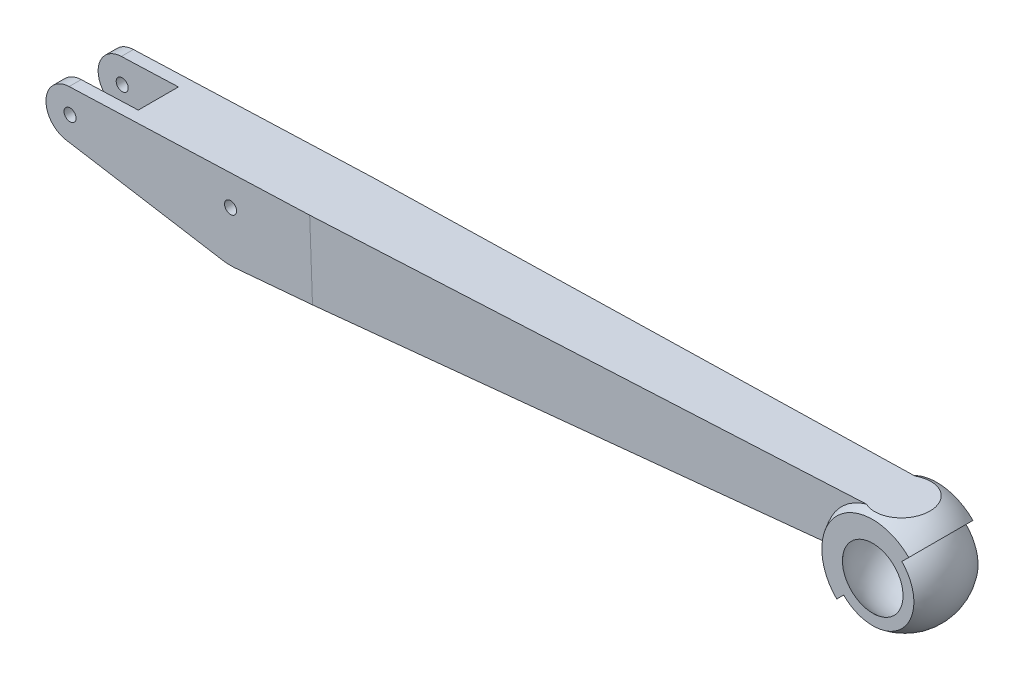
ISO-10303-21;
HEADER;
FILE_DESCRIPTION(('STEP AP214'),'2;1');
FILE_NAME('part.step','',(''),(''),'','','');
FILE_SCHEMA(('AUTOMOTIVE_DESIGN { 1 0 10303 214 1 1 1 1 }'));
ENDSEC;
DATA;
#1=APPLICATION_CONTEXT('core data for automotive mechanical design processes');
#2=APPLICATION_PROTOCOL_DEFINITION('international standard','automotive_design',2000,#1);
#3=PRODUCT_CONTEXT('',#1,'mechanical');
#4=PRODUCT('Part','Part','',(#3));
#5=PRODUCT_RELATED_PRODUCT_CATEGORY('part','',(#4));
#6=PRODUCT_DEFINITION_FORMATION('','',#4);
#7=PRODUCT_DEFINITION_CONTEXT('part definition',#1,'design');
#8=PRODUCT_DEFINITION('design','',#6,#7);
#9=PRODUCT_DEFINITION_SHAPE('','',#8);
#10=(LENGTH_UNIT() NAMED_UNIT(*) SI_UNIT(.MILLI.,.METRE.));
#11=(NAMED_UNIT(*) PLANE_ANGLE_UNIT() SI_UNIT($,.RADIAN.));
#12=(NAMED_UNIT(*) SI_UNIT($,.STERADIAN.) SOLID_ANGLE_UNIT());
#13=UNCERTAINTY_MEASURE_WITH_UNIT(LENGTH_MEASURE(1.E-05),#10,'distance_accuracy_value','');
#14=(GEOMETRIC_REPRESENTATION_CONTEXT(3) GLOBAL_UNCERTAINTY_ASSIGNED_CONTEXT((#13)) GLOBAL_UNIT_ASSIGNED_CONTEXT((#10,
#11,#12)) REPRESENTATION_CONTEXT('',''));
#15=CARTESIAN_POINT('',(0.,0.,0.));
#16=DIRECTION('',(0.,0.,1.));
#17=DIRECTION('',(1.,0.,0.));
#18=AXIS2_PLACEMENT_3D('',#15,#16,#17);
#19=CARTESIAN_POINT('',(0.,0.,8.));
#20=DIRECTION('',(0.,0.,-1.));
#21=DIRECTION('',(-1.,0.,0.));
#22=AXIS2_PLACEMENT_3D('',#19,#20,#21);
#23=CYLINDRICAL_SURFACE('',#22,12.5269384468381);
#24=CARTESIAN_POINT('',(0.,0.,-5.));
#25=DIRECTION('',(0.,0.,1.));
#26=DIRECTION('',(1.,0.,0.));
#27=AXIS2_PLACEMENT_3D('',#24,#25,#26);
#28=CIRCLE('',#27,12.5269384468381);
#29=CARTESIAN_POINT('',(-2.04406390424603,-12.3590448500775,-5.));
#30=VERTEX_POINT('',#29);
#31=CARTESIAN_POINT('',(1.08223577138531,-12.4801022666484,-5.));
#32=VERTEX_POINT('',#31);
#33=EDGE_CURVE('E243',#30,#32,#28,.T.);
#34=ORIENTED_EDGE('',*,*,#33,.F.);
#35=DIRECTION('',(0.,0.,-1.));
#36=VECTOR('',#35,1.);
#37=CARTESIAN_POINT('',(-2.04406390424603,-12.3590448500775,8.));
#38=LINE('',#37,#36);
#39=CARTESIAN_POINT('',(-2.04406390424603,-12.3590448500775,-8.));
#40=VERTEX_POINT('',#39);
#41=EDGE_CURVE('E341',#30,#40,#38,.T.);
#42=ORIENTED_EDGE('',*,*,#41,.T.);
#43=CARTESIAN_POINT('',(0.,0.,-8.));
#44=DIRECTION('',(0.,0.,1.));
#45=DIRECTION('',(1.,0.,0.));
#46=AXIS2_PLACEMENT_3D('',#43,#44,#45);
#47=CIRCLE('',#46,12.5269384468381);
#48=CARTESIAN_POINT('',(1.08223577138531,-12.4801022666484,-8.));
#49=VERTEX_POINT('',#48);
#50=EDGE_CURVE('E327',#40,#49,#47,.T.);
#51=ORIENTED_EDGE('',*,*,#50,.T.);
#52=DIRECTION('',(0.,0.,-1.));
#53=VECTOR('',#52,1.);
#54=CARTESIAN_POINT('',(1.08223577138531,-12.4801022666484,8.));
#55=LINE('',#54,#53);
#56=EDGE_CURVE('E366',#32,#49,#55,.T.);
#57=ORIENTED_EDGE('',*,*,#56,.F.);
#58=EDGE_LOOP('',(#34,#42,#51,#57));
#59=FACE_BOUND('',#58,.T.);
#60=ADVANCED_FACE('F35',(#59),#23,.T.);
#61=CARTESIAN_POINT('',(160.,0.,0.));
#62=DIRECTION('',(-1.,0.,0.));
#63=DIRECTION('',(0.,1.,0.));
#64=AXIS2_PLACEMENT_3D('',#61,#62,#63);
#65=SPHERICAL_SURFACE('',#64,15.);
#66=CARTESIAN_POINT('',(159.505151467158,13.3817007512717,0.));
#67=DIRECTION('',(0.0369542362489187,-0.999316958939084,0.));
#68=DIRECTION('',(0.999316958939084,0.0369542362489187,0.));
#69=AXIS2_PLACEMENT_3D('',#66,#67,#68);
#70=CIRCLE('',#69,6.75908351279662);
#71=CARTESIAN_POINT('',(156.493436870342,13.2703290671133,6.04999020397985));
#72=VERTEX_POINT('',#71);
#73=CARTESIAN_POINT('',(156.493436870342,13.2703290671133,-6.04999020397985));
#74=VERTEX_POINT('',#73);
#75=EDGE_CURVE('E379',#72,#74,#70,.F.);
#76=ORIENTED_EDGE('',*,*,#75,.F.);
#77=CARTESIAN_POINT('',(160.08550336549,0.00316187125628183,6.00583569941776));
#78=DIRECTION('',(-0.0142352695206122,-0.000526413074676742,-0.999898534847887));
#79=DIRECTION('',(-0.999898673389219,0.,0.0142352714929856));
#80=AXIS2_PLACEMENT_3D('',#77,#78,#79);
#81=CIRCLE('',#80,13.744912394361);
#82=CARTESIAN_POINT('',(146.342449375036,0.116413047256878,6.20143200631746));
#83=VERTEX_POINT('',#82);
#84=EDGE_CURVE('E376',#83,#72,#81,.T.);
#85=ORIENTED_EDGE('',*,*,#84,.F.);
#86=CARTESIAN_POINT('',(159.888044575374,1.29104506206708,0.));
#87=DIRECTION('',(-0.0863926789437108,0.996261163061639,0.));
#88=DIRECTION('',(-0.996261163061639,-0.0863926789437108,0.));
#89=AXIS2_PLACEMENT_3D('',#86,#87,#88);
#90=CIRCLE('',#89,14.9439174459246);
#91=CARTESIAN_POINT('',(146.342449375036,0.116413047256877,-6.20143200631746));
#92=VERTEX_POINT('',#91);
#93=EDGE_CURVE('E311',#92,#83,#90,.T.);
#94=ORIENTED_EDGE('',*,*,#93,.F.);
#95=CARTESIAN_POINT('',(160.08550336549,0.00316187125628183,-6.00583569941776));
#96=DIRECTION('',(-0.0142352695206122,-0.000526413074676742,0.999898534847887));
#97=DIRECTION('',(0.999898673389219,0.,0.0142352714929856));
#98=AXIS2_PLACEMENT_3D('',#95,#96,#97);
#99=CIRCLE('',#98,13.744912394361);
#100=EDGE_CURVE('E314',#74,#92,#99,.T.);
#101=ORIENTED_EDGE('',*,*,#100,.F.);
#102=EDGE_LOOP('',(#76,#85,#94,#101));
#103=FACE_BOUND('',#102,.T.);
#104=CARTESIAN_POINT('',(160.,0.,-8.));
#105=DIRECTION('',(0.,0.,1.));
#106=DIRECTION('',(1.,0.,0.));
#107=AXIS2_PLACEMENT_3D('',#104,#105,#106);
#108=CIRCLE('',#107,12.6885775404495);
#109=CARTESIAN_POINT('',(151.027820777537,-8.97217922246309,-7.99999999999999));
#110=VERTEX_POINT('',#109);
#111=CARTESIAN_POINT('',(168.972179222463,8.97217922246318,-7.99999999999999));
#112=VERTEX_POINT('',#111);
#113=EDGE_CURVE('E296',#110,#112,#108,.F.);
#114=ORIENTED_EDGE('',*,*,#113,.F.);
#115=CARTESIAN_POINT('',(160.,0.,0.));
#116=DIRECTION('',(0.707106781186544,-0.707106781186551,0.));
#117=DIRECTION('',(0.707106781186551,0.707106781186544,0.));
#118=AXIS2_PLACEMENT_3D('',#115,#116,#117);
#119=CIRCLE('',#118,15.);
#120=CARTESIAN_POINT('',(151.027820777537,-8.97217922246309,7.99999999999999));
#121=VERTEX_POINT('',#120);
#122=EDGE_CURVE('E278',#121,#110,#119,.T.);
#123=ORIENTED_EDGE('',*,*,#122,.F.);
#124=CARTESIAN_POINT('',(160.,0.,8.));
#125=DIRECTION('',(0.,0.,-1.));
#126=DIRECTION('',(-1.,0.,0.));
#127=AXIS2_PLACEMENT_3D('',#124,#125,#126);
#128=CIRCLE('',#127,12.6885775404495);
#129=CARTESIAN_POINT('',(168.972179222463,8.97217922246319,8.));
#130=VERTEX_POINT('',#129);
#131=EDGE_CURVE('E288',#130,#121,#128,.F.);
#132=ORIENTED_EDGE('',*,*,#131,.F.);
#133=CARTESIAN_POINT('',(160.,0.,0.));
#134=DIRECTION('',(-0.707106781186549,0.707106781186546,0.));
#135=DIRECTION('',(-0.707106781186546,-0.707106781186549,0.));
#136=AXIS2_PLACEMENT_3D('',#133,#134,#135);
#137=CIRCLE('',#136,15.);
#138=EDGE_CURVE('E60',#130,#112,#137,.T.);
#139=ORIENTED_EDGE('',*,*,#138,.T.);
#140=EDGE_LOOP('',(#114,#123,#132,#139));
#141=FACE_BOUND('',#140,.T.);
#142=ADVANCED_FACE('F474',(#103,#141),#65,.T.);
#143=CARTESIAN_POINT('',(130.,-15.,-8.));
#144=DIRECTION('',(0.,0.,1.));
#145=DIRECTION('',(1.,0.,0.));
#146=AXIS2_PLACEMENT_3D('',#143,#144,#145);
#147=PLANE('',#146);
#148=CARTESIAN_POINT('',(160.,0.,-8.));
#149=DIRECTION('',(0.,0.,1.));
#150=DIRECTION('',(1.,0.,0.));
#151=AXIS2_PLACEMENT_3D('',#148,#149,#150);
#152=CIRCLE('',#151,7.54983443527072);
#153=CARTESIAN_POINT('',(165.338539126016,5.33853912601566,-8.));
#154=VERTEX_POINT('',#153);
#155=EDGE_CURVE('E262',#154,#154,#152,.F.);
#156=ORIENTED_EDGE('',*,*,#155,.F.);
#157=EDGE_LOOP('',(#156));
#158=FACE_BOUND('',#157,.T.);
#159=DIRECTION('',(0.707106781186552,0.707106781186543,0.));
#160=VECTOR('',#159,1.);
#161=CARTESIAN_POINT('',(151.027820777537,-8.97217922246309,-7.99999999999999));
#162=LINE('',#161,#160);
#163=CARTESIAN_POINT('',(152.754311626905,-7.24568837309467,-7.99999999999998));
#164=VERTEX_POINT('',#163);
#165=EDGE_CURVE('E280',#110,#164,#162,.T.);
#166=ORIENTED_EDGE('',*,*,#165,.F.);
#167=ORIENTED_EDGE('',*,*,#113,.T.);
#168=DIRECTION('',(-0.707106781186548,-0.707106781186548,0.));
#169=VECTOR('',#168,1.);
#170=CARTESIAN_POINT('',(168.972179222463,8.97217922246318,-7.99999999999999));
#171=LINE('',#170,#169);
#172=CARTESIAN_POINT('',(167.245688373095,7.24568837309475,-7.99999999999998));
#173=VERTEX_POINT('',#172);
#174=EDGE_CURVE('E270',#112,#173,#171,.T.);
#175=ORIENTED_EDGE('',*,*,#174,.T.);
#176=CARTESIAN_POINT('',(160.,0.,-7.99999999999999));
#177=DIRECTION('',(0.,0.,1.));
#178=DIRECTION('',(1.,0.,0.));
#179=AXIS2_PLACEMENT_3D('',#176,#177,#178);
#180=CIRCLE('',#179,10.2469507659596);
#181=EDGE_CURVE('E283',#164,#173,#180,.T.);
#182=ORIENTED_EDGE('',*,*,#181,.F.);
#183=EDGE_LOOP('',(#166,#167,#175,#182));
#184=FACE_BOUND('',#183,.T.);
#185=ADVANCED_FACE('F477',(#158,#184),#147,.F.);
#186=CARTESIAN_POINT('',(130.,-15.,8.));
#187=DIRECTION('',(0.,0.,-1.));
#188=DIRECTION('',(-1.,0.,0.));
#189=AXIS2_PLACEMENT_3D('',#186,#187,#188);
#190=PLANE('',#189);
#191=CARTESIAN_POINT('',(160.,0.,8.));
#192=DIRECTION('',(0.,0.,-1.));
#193=DIRECTION('',(-1.,0.,0.));
#194=AXIS2_PLACEMENT_3D('',#191,#192,#193);
#195=CIRCLE('',#194,7.54983443527072);
#196=CARTESIAN_POINT('',(165.338539126016,5.33853912601566,8.));
#197=VERTEX_POINT('',#196);
#198=EDGE_CURVE('E261',#197,#197,#195,.F.);
#199=ORIENTED_EDGE('',*,*,#198,.F.);
#200=EDGE_LOOP('',(#199));
#201=FACE_BOUND('',#200,.T.);
#202=DIRECTION('',(-0.70710678118655,-0.707106781186545,0.));
#203=VECTOR('',#202,1.);
#204=CARTESIAN_POINT('',(151.027820777537,-8.97217922246309,7.99999999999999));
#205=LINE('',#204,#203);
#206=CARTESIAN_POINT('',(152.754311626905,-7.24568837309466,7.99999999999999));
#207=VERTEX_POINT('',#206);
#208=EDGE_CURVE('E276',#207,#121,#205,.T.);
#209=ORIENTED_EDGE('',*,*,#208,.F.);
#210=CARTESIAN_POINT('',(160.,0.,7.99999999999999));
#211=DIRECTION('',(0.,0.,1.));
#212=DIRECTION('',(1.,0.,0.));
#213=AXIS2_PLACEMENT_3D('',#210,#211,#212);
#214=CIRCLE('',#213,10.2469507659596);
#215=CARTESIAN_POINT('',(167.245688373095,7.24568837309474,7.99999999999999));
#216=VERTEX_POINT('',#215);
#217=EDGE_CURVE('E285',#207,#216,#214,.T.);
#218=ORIENTED_EDGE('',*,*,#217,.T.);
#219=DIRECTION('',(0.707106781186545,0.70710678118655,0.));
#220=VECTOR('',#219,1.);
#221=CARTESIAN_POINT('',(168.972179222463,8.97217922246318,7.99999999999999));
#222=LINE('',#221,#220);
#223=EDGE_CURVE('E267',#216,#130,#222,.T.);
#224=ORIENTED_EDGE('',*,*,#223,.T.);
#225=ORIENTED_EDGE('',*,*,#131,.T.);
#226=EDGE_LOOP('',(#209,#218,#224,#225));
#227=FACE_BOUND('',#226,.T.);
#228=ADVANCED_FACE('F489',(#201,#227),#190,.F.);
#229=CARTESIAN_POINT('',(-40.,0.,8.));
#230=DIRECTION('',(0.,0.,-1.));
#231=DIRECTION('',(-1.,0.,0.));
#232=AXIS2_PLACEMENT_3D('',#229,#230,#231);
#233=CYLINDRICAL_SURFACE('',#232,6.);
#234=DIRECTION('',(0.,0.,-1.));
#235=VECTOR('',#234,1.);
#236=CARTESIAN_POINT('',(-40.9790407670257,-5.91958437531739,8.));
#237=LINE('',#236,#235);
#238=CARTESIAN_POINT('',(-40.9790407670257,-5.91958437531739,-4.99999999999999));
#239=VERTEX_POINT('',#238);
#240=CARTESIAN_POINT('',(-40.9790407670257,-5.91958437531739,-8.));
#241=VERTEX_POINT('',#240);
#242=EDGE_CURVE('E358',#239,#241,#237,.T.);
#243=ORIENTED_EDGE('',*,*,#242,.F.);
#244=CARTESIAN_POINT('',(-40.,0.,-4.99999999999999));
#245=DIRECTION('',(0.,0.,-1.));
#246=DIRECTION('',(-1.,0.,0.));
#247=AXIS2_PLACEMENT_3D('',#244,#245,#246);
#248=CIRCLE('',#247,6.);
#249=CARTESIAN_POINT('',(-40.2217254174935,5.9959017536345,-4.99999999999999));
#250=VERTEX_POINT('',#249);
#251=EDGE_CURVE('E305',#239,#250,#248,.T.);
#252=ORIENTED_EDGE('',*,*,#251,.T.);
#253=DIRECTION('',(0.,0.,-1.));
#254=VECTOR('',#253,1.);
#255=CARTESIAN_POINT('',(-40.2217254174935,5.9959017536345,8.));
#256=LINE('',#255,#254);
#257=CARTESIAN_POINT('',(-40.2217254174935,5.9959017536345,-8.));
#258=VERTEX_POINT('',#257);
#259=EDGE_CURVE('E362',#250,#258,#256,.T.);
#260=ORIENTED_EDGE('',*,*,#259,.T.);
#261=CARTESIAN_POINT('',(-40.,0.,-8.));
#262=DIRECTION('',(0.,0.,1.));
#263=DIRECTION('',(1.,0.,0.));
#264=AXIS2_PLACEMENT_3D('',#261,#262,#263);
#265=CIRCLE('',#264,6.);
#266=EDGE_CURVE('E350',#258,#241,#265,.T.);
#267=ORIENTED_EDGE('',*,*,#266,.T.);
#268=EDGE_LOOP('',(#243,#252,#260,#267));
#269=FACE_BOUND('',#268,.T.);
#270=ADVANCED_FACE('F473',(#269),#233,.T.);
#271=CARTESIAN_POINT('',(-2.04406390424603,-12.3590448500775,8.));
#272=VERTEX_POINT('',#271);
#273=CARTESIAN_POINT('',(-2.04406390424603,-12.3590448500775,5.));
#274=VERTEX_POINT('',#273);
#275=EDGE_CURVE('E355',#272,#274,#38,.T.);
#276=ORIENTED_EDGE('',*,*,#275,.T.);
#277=CARTESIAN_POINT('',(0.,0.,5.));
#278=DIRECTION('',(0.,0.,1.));
#279=DIRECTION('',(1.,0.,0.));
#280=AXIS2_PLACEMENT_3D('',#277,#278,#279);
#281=CIRCLE('',#280,12.5269384468381);
#282=CARTESIAN_POINT('',(1.08223577138531,-12.4801022666484,5.));
#283=VERTEX_POINT('',#282);
#284=EDGE_CURVE('E235',#274,#283,#281,.T.);
#285=ORIENTED_EDGE('',*,*,#284,.T.);
#286=CARTESIAN_POINT('',(1.08223577138531,-12.4801022666484,8.));
#287=VERTEX_POINT('',#286);
#288=EDGE_CURVE('E367',#287,#283,#55,.T.);
#289=ORIENTED_EDGE('',*,*,#288,.F.);
#290=CARTESIAN_POINT('',(0.,0.,8.));
#291=DIRECTION('',(0.,0.,1.));
#292=DIRECTION('',(1.,0.,0.));
#293=AXIS2_PLACEMENT_3D('',#290,#291,#292);
#294=CIRCLE('',#293,12.5269384468381);
#295=EDGE_CURVE('E328',#272,#287,#294,.T.);
#296=ORIENTED_EDGE('',*,*,#295,.F.);
#297=EDGE_LOOP('',(#276,#285,#289,#296));
#298=FACE_BOUND('',#297,.T.);
#299=ADVANCED_FACE('F37',(#298),#23,.T.);
#300=CARTESIAN_POINT('',(145.,0.,8.));
#301=DIRECTION('',(-0.0863926789437108,0.996261163061639,0.));
#302=DIRECTION('',(-0.996261163061639,-0.0863926789437108,0.));
#303=AXIS2_PLACEMENT_3D('',#300,#301,#302);
#304=PLANE('',#303);
#305=ORIENTED_EDGE('',*,*,#288,.T.);
#306=DIRECTION('',(0.996261163061639,0.0863926789437108,0.));
#307=VECTOR('',#306,1.);
#308=CARTESIAN_POINT('',(145.,0.,5.));
#309=LINE('',#308,#307);
#310=CARTESIAN_POINT('',(20.3918737201203,-10.8056303373225,5.));
#311=VERTEX_POINT('',#310);
#312=EDGE_CURVE('E211',#283,#311,#309,.T.);
#313=ORIENTED_EDGE('',*,*,#312,.T.);
#314=DIRECTION('',(-0.996160325095163,-0.0863839345879274,0.0142275279443665));
#315=VECTOR('',#314,1.);
#316=CARTESIAN_POINT('',(144.932257808565,-0.00587439279233178,3.22126845430105));
#317=LINE('',#316,#315);
#318=CARTESIAN_POINT('',(143.313103636008,-0.146282422108911,3.24439380938292));
#319=VERTEX_POINT('',#318);
#320=EDGE_CURVE('E220',#319,#311,#317,.T.);
#321=ORIENTED_EDGE('',*,*,#320,.F.);
#322=CARTESIAN_POINT('',(159.888044575374,1.29104506206708,0.));
#323=DIRECTION('',(-0.0863926789437108,0.996261163061639,0.));
#324=DIRECTION('',(-0.996261163061639,-0.0863926789437108,0.));
#325=AXIS2_PLACEMENT_3D('',#322,#323,#324);
#326=CIRCLE('',#325,16.9505359393327);
#327=CARTESIAN_POINT('',(143.313103636008,-0.146282422108912,-3.24439380938292));
#328=VERTEX_POINT('',#327);
#329=EDGE_CURVE('E258',#328,#319,#326,.T.);
#330=ORIENTED_EDGE('',*,*,#329,.F.);
#331=DIRECTION('',(0.996160325095163,0.0863839345879274,0.0142275279443665));
#332=VECTOR('',#331,1.);
#333=CARTESIAN_POINT('',(145.159024190363,0.0137900847003733,-3.21802969347853));
#334=LINE('',#333,#332);
#335=CARTESIAN_POINT('',(20.3918737201203,-10.8056303373225,-5.));
#336=VERTEX_POINT('',#335);
#337=EDGE_CURVE('E246',#336,#328,#334,.T.);
#338=ORIENTED_EDGE('',*,*,#337,.F.);
#339=DIRECTION('',(0.996261163061639,0.0863926789437108,0.));
#340=VECTOR('',#339,1.);
#341=CARTESIAN_POINT('',(145.,0.,-5.));
#342=LINE('',#341,#340);
#343=EDGE_CURVE('E245',#32,#336,#342,.T.);
#344=ORIENTED_EDGE('',*,*,#343,.F.);
#345=ORIENTED_EDGE('',*,*,#56,.T.);
#346=DIRECTION('',(0.996261163061639,0.0863926789437108,0.));
#347=VECTOR('',#346,1.);
#348=CARTESIAN_POINT('',(145.,0.,-8.));
#349=LINE('',#348,#347);
#350=CARTESIAN_POINT('',(20.4131885576658,-10.8037819807017,-8.));
#351=VERTEX_POINT('',#350);
#352=EDGE_CURVE('E344',#49,#351,#349,.T.);
#353=ORIENTED_EDGE('',*,*,#352,.T.);
#354=DIRECTION('',(0.996160325095163,0.0863839345879274,0.0142275279443665));
#355=VECTOR('',#354,1.);
#356=CARTESIAN_POINT('',(145.201547201554,0.0174775483793186,-6.21772679054655));
#357=LINE('',#356,#355);
#358=EDGE_CURVE('E324',#351,#92,#357,.T.);
#359=ORIENTED_EDGE('',*,*,#358,.T.);
#360=ORIENTED_EDGE('',*,*,#93,.T.);
#361=DIRECTION('',(-0.996160325095163,-0.0863839345879274,0.0142275279443665));
#362=VECTOR('',#361,1.);
#363=CARTESIAN_POINT('',(144.974780819756,-0.00218692911338649,6.22096555136907));
#364=LINE('',#363,#362);
#365=CARTESIAN_POINT('',(20.4131885576658,-10.8037819807017,8.));
#366=VERTEX_POINT('',#365);
#367=EDGE_CURVE('E320',#83,#366,#364,.T.);
#368=ORIENTED_EDGE('',*,*,#367,.T.);
#369=DIRECTION('',(0.996261163061639,0.0863926789437108,0.));
#370=VECTOR('',#369,1.);
#371=CARTESIAN_POINT('',(1.08223577138531,-12.4801022666484,8.));
#372=LINE('',#371,#370);
#373=EDGE_CURVE('E331',#287,#366,#372,.T.);
#374=ORIENTED_EDGE('',*,*,#373,.F.);
#375=EDGE_LOOP('',(#305,#313,#321,#330,#338,#344,#345,#353,#359,#360,#368,#374));
#376=FACE_BOUND('',#375,.T.);
#377=ADVANCED_FACE('F431',(#376),#304,.F.);
#378=CARTESIAN_POINT('',(-40.2217254174935,5.9959017536345,8.));
#379=DIRECTION('',(0.0369542362489186,-0.999316958939084,0.));
#380=DIRECTION('',(0.999316958939084,0.0369542362489187,0.));
#381=AXIS2_PLACEMENT_3D('',#378,#379,#380);
#382=PLANE('',#381);
#383=ORIENTED_EDGE('',*,*,#259,.F.);
#384=DIRECTION('',(0.999316958939084,0.0369542362489187,0.));
#385=VECTOR('',#384,1.);
#386=CARTESIAN_POINT('',(-40.2217254174935,5.9959017536345,-4.99999999999999));
#387=LINE('',#386,#385);
#388=CARTESIAN_POINT('',(-26.,6.52181397422091,-4.99999999999999));
#389=VERTEX_POINT('',#388);
#390=EDGE_CURVE('E308',#250,#389,#387,.T.);
#391=ORIENTED_EDGE('',*,*,#390,.T.);
#392=DIRECTION('',(0.,0.,1.));
#393=VECTOR('',#392,1.);
#394=CARTESIAN_POINT('',(-26.,6.52181397422091,8.));
#395=LINE('',#394,#393);
#396=CARTESIAN_POINT('',(-26.,6.5218139742209,5.));
#397=VERTEX_POINT('',#396);
#398=EDGE_CURVE('E302',#389,#397,#395,.T.);
#399=ORIENTED_EDGE('',*,*,#398,.T.);
#400=DIRECTION('',(-0.999316958939084,-0.0369542362489187,0.));
#401=VECTOR('',#400,1.);
#402=CARTESIAN_POINT('',(-40.2217254174935,5.9959017536345,5.));
#403=LINE('',#402,#401);
#404=CARTESIAN_POINT('',(-40.2217254174935,5.9959017536345,5.));
#405=VERTEX_POINT('',#404);
#406=EDGE_CURVE('E299',#397,#405,#403,.T.);
#407=ORIENTED_EDGE('',*,*,#406,.T.);
#408=CARTESIAN_POINT('',(-40.2217254174935,5.9959017536345,8.));
#409=VERTEX_POINT('',#408);
#410=EDGE_CURVE('E363',#409,#405,#256,.T.);
#411=ORIENTED_EDGE('',*,*,#410,.F.);
#412=DIRECTION('',(-0.999316958939084,-0.0369542362489186,0.));
#413=VECTOR('',#412,1.);
#414=CARTESIAN_POINT('',(147.077854414978,12.9221455850216,8.));
#415=LINE('',#414,#413);
#416=CARTESIAN_POINT('',(19.7099891382185,8.21214627814031,8.));
#417=VERTEX_POINT('',#416);
#418=EDGE_CURVE('E335',#417,#409,#415,.T.);
#419=ORIENTED_EDGE('',*,*,#418,.F.);
#420=DIRECTION('',(0.999215563091836,0.0369504866817164,-0.0142449994401426));
#421=VECTOR('',#420,1.);
#422=CARTESIAN_POINT('',(-40.2095640734335,5.99635147399347,8.85422408685515));
#423=LINE('',#422,#421);
#424=EDGE_CURVE('E317',#417,#72,#423,.T.);
#425=ORIENTED_EDGE('',*,*,#424,.T.);
#426=ORIENTED_EDGE('',*,*,#75,.T.);
#427=DIRECTION('',(-0.999215563091836,-0.0369504866817164,-0.0142449994401426));
#428=VECTOR('',#427,1.);
#429=CARTESIAN_POINT('',(-39.9818228712443,6.00477322858698,-8.85097736671036));
#430=LINE('',#429,#428);
#431=CARTESIAN_POINT('',(19.7099891382185,8.21214627814031,-8.));
#432=VERTEX_POINT('',#431);
#433=EDGE_CURVE('E322',#74,#432,#430,.T.);
#434=ORIENTED_EDGE('',*,*,#433,.T.);
#435=DIRECTION('',(-0.999316958939084,-0.0369542362489186,0.));
#436=VECTOR('',#435,1.);
#437=CARTESIAN_POINT('',(-40.2217254174935,5.9959017536345,-8.));
#438=LINE('',#437,#436);
#439=EDGE_CURVE('E347',#432,#258,#438,.T.);
#440=ORIENTED_EDGE('',*,*,#439,.T.);
#441=EDGE_LOOP('',(#383,#391,#399,#407,#411,#419,#425,#426,#434,#440));
#442=FACE_BOUND('',#441,.T.);
#443=ADVANCED_FACE('F464',(#442),#382,.F.);
#444=ORIENTED_EDGE('',*,*,#410,.T.);
#445=CARTESIAN_POINT('',(-40.,0.,5.));
#446=DIRECTION('',(0.,0.,1.));
#447=DIRECTION('',(1.,0.,0.));
#448=AXIS2_PLACEMENT_3D('',#445,#446,#447);
#449=CIRCLE('',#448,6.);
#450=CARTESIAN_POINT('',(-40.9790407670257,-5.91958437531739,5.));
#451=VERTEX_POINT('',#450);
#452=EDGE_CURVE('E292',#405,#451,#449,.T.);
#453=ORIENTED_EDGE('',*,*,#452,.T.);
#454=CARTESIAN_POINT('',(-40.9790407670257,-5.91958437531739,8.));
#455=VERTEX_POINT('',#454);
#456=EDGE_CURVE('E359',#455,#451,#237,.T.);
#457=ORIENTED_EDGE('',*,*,#456,.F.);
#458=CARTESIAN_POINT('',(-40.,0.,8.));
#459=DIRECTION('',(0.,0.,1.));
#460=DIRECTION('',(1.,0.,0.));
#461=AXIS2_PLACEMENT_3D('',#458,#459,#460);
#462=CIRCLE('',#461,6.);
#463=EDGE_CURVE('E337',#409,#455,#462,.T.);
#464=ORIENTED_EDGE('',*,*,#463,.F.);
#465=EDGE_LOOP('',(#444,#453,#457,#464));
#466=FACE_BOUND('',#465,.T.);
#467=ADVANCED_FACE('F459',(#466),#233,.T.);
#468=CARTESIAN_POINT('',(-40.9790407670257,-5.91958437531739,8.));
#469=DIRECTION('',(0.163173461170952,0.986597395886231,0.));
#470=DIRECTION('',(-0.986597395886231,0.163173461170952,0.));
#471=AXIS2_PLACEMENT_3D('',#468,#469,#470);
#472=PLANE('',#471);
#473=DIRECTION('',(0.,0.,-1.));
#474=VECTOR('',#473,1.);
#475=CARTESIAN_POINT('',(-23.,-8.89314007566866,8.));
#476=LINE('',#475,#474);
#477=CARTESIAN_POINT('',(-23.,-8.89314007566866,5.));
#478=VERTEX_POINT('',#477);
#479=CARTESIAN_POINT('',(-23.,-8.89314007566866,-5.));
#480=VERTEX_POINT('',#479);
#481=EDGE_CURVE('E52',#478,#480,#476,.T.);
#482=ORIENTED_EDGE('',*,*,#481,.F.);
#483=DIRECTION('',(0.986597395886231,-0.163173461170952,0.));
#484=VECTOR('',#483,1.);
#485=CARTESIAN_POINT('',(-40.9790407670257,-5.91958437531739,5.));
#486=LINE('',#485,#484);
#487=EDGE_CURVE('E210',#478,#274,#486,.T.);
#488=ORIENTED_EDGE('',*,*,#487,.T.);
#489=ORIENTED_EDGE('',*,*,#275,.F.);
#490=DIRECTION('',(0.986597395886231,-0.163173461170952,0.));
#491=VECTOR('',#490,1.);
#492=CARTESIAN_POINT('',(-40.9790407670257,-5.91958437531739,8.));
#493=LINE('',#492,#491);
#494=EDGE_CURVE('E339',#455,#272,#493,.T.);
#495=ORIENTED_EDGE('',*,*,#494,.F.);
#496=ORIENTED_EDGE('',*,*,#456,.T.);
#497=DIRECTION('',(0.986597395886231,-0.163173461170952,0.));
#498=VECTOR('',#497,1.);
#499=CARTESIAN_POINT('',(-40.9790407670257,-5.91958437531739,5.));
#500=LINE('',#499,#498);
#501=CARTESIAN_POINT('',(-26.,-8.39696971726919,5.));
#502=VERTEX_POINT('',#501);
#503=EDGE_CURVE('E381',#451,#502,#500,.T.);
#504=ORIENTED_EDGE('',*,*,#503,.T.);
#505=DIRECTION('',(0.,0.,-1.));
#506=VECTOR('',#505,1.);
#507=CARTESIAN_POINT('',(-26.,-8.39696971726919,8.));
#508=LINE('',#507,#506);
#509=CARTESIAN_POINT('',(-26.,-8.39696971726919,-4.99999999999999));
#510=VERTEX_POINT('',#509);
#511=EDGE_CURVE('E44',#502,#510,#508,.T.);
#512=ORIENTED_EDGE('',*,*,#511,.T.);
#513=DIRECTION('',(-0.986597395886231,0.163173461170952,0.));
#514=VECTOR('',#513,1.);
#515=CARTESIAN_POINT('',(-40.9790407670257,-5.91958437531739,-4.99999999999999));
#516=LINE('',#515,#514);
#517=EDGE_CURVE('E11',#510,#239,#516,.T.);
#518=ORIENTED_EDGE('',*,*,#517,.T.);
#519=ORIENTED_EDGE('',*,*,#242,.T.);
#520=DIRECTION('',(0.986597395886231,-0.163173461170952,0.));
#521=VECTOR('',#520,1.);
#522=CARTESIAN_POINT('',(-40.9790407670257,-5.91958437531739,-8.));
#523=LINE('',#522,#521);
#524=EDGE_CURVE('E332',#241,#40,#523,.T.);
#525=ORIENTED_EDGE('',*,*,#524,.T.);
#526=ORIENTED_EDGE('',*,*,#41,.F.);
#527=DIRECTION('',(0.986597395886231,-0.163173461170952,0.));
#528=VECTOR('',#527,1.);
#529=CARTESIAN_POINT('',(-40.9790407670257,-5.91958437531739,-5.));
#530=LINE('',#529,#528);
#531=EDGE_CURVE('E238',#480,#30,#530,.T.);
#532=ORIENTED_EDGE('',*,*,#531,.F.);
#533=EDGE_LOOP('',(#482,#488,#489,#495,#496,#504,#512,#518,#519,#525,#526,#532));
#534=FACE_BOUND('',#533,.T.);
#535=ADVANCED_FACE('F422',(#534),#472,.F.);
#536=CARTESIAN_POINT('',(0.,0.,8.));
#537=DIRECTION('',(0.,0.,1.));
#538=DIRECTION('',(1.,0.,0.));
#539=AXIS2_PLACEMENT_3D('',#536,#537,#538);
#540=PLANE('',#539);
#541=CARTESIAN_POINT('',(0.,0.,8.));
#542=DIRECTION('',(0.,0.,-1.));
#543=DIRECTION('',(-1.,0.,0.));
#544=AXIS2_PLACEMENT_3D('',#541,#542,#543);
#545=CIRCLE('',#544,1.5);
#546=CARTESIAN_POINT('',(-1.5,0.,8.));
#547=VERTEX_POINT('',#546);
#548=EDGE_CURVE('E780',#547,#547,#545,.T.);
#549=ORIENTED_EDGE('',*,*,#548,.T.);
#550=EDGE_LOOP('',(#549));
#551=FACE_BOUND('',#550,.T.);
#552=CARTESIAN_POINT('',(-40.,0.,8.));
#553=DIRECTION('',(0.,0.,-1.));
#554=DIRECTION('',(-1.,0.,0.));
#555=AXIS2_PLACEMENT_3D('',#552,#553,#554);
#556=CIRCLE('',#555,1.5);
#557=CARTESIAN_POINT('',(-41.5,0.,8.));
#558=VERTEX_POINT('',#557);
#559=EDGE_CURVE('E394',#558,#558,#556,.T.);
#560=ORIENTED_EDGE('',*,*,#559,.T.);
#561=EDGE_LOOP('',(#560));
#562=FACE_BOUND('',#561,.T.);
#563=DIRECTION('',(0.0369542362489187,-0.999316958939084,0.));
#564=VECTOR('',#563,1.);
#565=CARTESIAN_POINT('',(19.9863391787817,0.739084724978373,8.));
#566=LINE('',#565,#564);
#567=EDGE_CURVE('E373',#417,#366,#566,.T.);
#568=ORIENTED_EDGE('',*,*,#567,.F.);
#569=ORIENTED_EDGE('',*,*,#418,.T.);
#570=ORIENTED_EDGE('',*,*,#463,.T.);
#571=ORIENTED_EDGE('',*,*,#494,.T.);
#572=ORIENTED_EDGE('',*,*,#295,.T.);
#573=ORIENTED_EDGE('',*,*,#373,.T.);
#574=EDGE_LOOP('',(#568,#569,#570,#571,#572,#573));
#575=FACE_BOUND('',#574,.T.);
#576=ADVANCED_FACE('F450',(#551,#562,#575),#540,.T.);
#577=CARTESIAN_POINT('',(0.,0.,-8.));
#578=DIRECTION('',(0.,0.,1.));
#579=DIRECTION('',(1.,0.,0.));
#580=AXIS2_PLACEMENT_3D('',#577,#578,#579);
#581=PLANE('',#580);
#582=CARTESIAN_POINT('',(0.,0.,-8.));
#583=DIRECTION('',(0.,0.,1.));
#584=DIRECTION('',(1.,0.,0.));
#585=AXIS2_PLACEMENT_3D('',#582,#583,#584);
#586=CIRCLE('',#585,1.5);
#587=CARTESIAN_POINT('',(1.5,0.,-8.));
#588=VERTEX_POINT('',#587);
#589=EDGE_CURVE('E401',#588,#588,#586,.T.);
#590=ORIENTED_EDGE('',*,*,#589,.T.);
#591=EDGE_LOOP('',(#590));
#592=FACE_BOUND('',#591,.T.);
#593=CARTESIAN_POINT('',(-40.,0.,-8.));
#594=DIRECTION('',(0.,0.,1.));
#595=DIRECTION('',(1.,0.,0.));
#596=AXIS2_PLACEMENT_3D('',#593,#594,#595);
#597=CIRCLE('',#596,1.5);
#598=CARTESIAN_POINT('',(-38.5,0.,-8.));
#599=VERTEX_POINT('',#598);
#600=EDGE_CURVE('E398',#599,#599,#597,.T.);
#601=ORIENTED_EDGE('',*,*,#600,.T.);
#602=EDGE_LOOP('',(#601));
#603=FACE_BOUND('',#602,.T.);
#604=ORIENTED_EDGE('',*,*,#439,.F.);
#605=DIRECTION('',(0.0369542362489187,-0.999316958939084,0.));
#606=VECTOR('',#605,1.);
#607=CARTESIAN_POINT('',(19.9863391787817,0.739084724978373,-8.));
#608=LINE('',#607,#606);
#609=EDGE_CURVE('E370',#432,#351,#608,.T.);
#610=ORIENTED_EDGE('',*,*,#609,.T.);
#611=ORIENTED_EDGE('',*,*,#352,.F.);
#612=ORIENTED_EDGE('',*,*,#50,.F.);
#613=ORIENTED_EDGE('',*,*,#524,.F.);
#614=ORIENTED_EDGE('',*,*,#266,.F.);
#615=EDGE_LOOP('',(#604,#610,#611,#612,#613,#614));
#616=FACE_BOUND('',#615,.T.);
#617=ADVANCED_FACE('F435',(#592,#603,#616),#581,.F.);
#618=CARTESIAN_POINT('',(20.6693899111684,-17.7319824645047,-8.));
#619=DIRECTION('',(-0.0142352695206122,-0.000526413074676742,0.999898534847887));
#620=DIRECTION('',(0.999898673389219,0.,0.0142352714929856));
#621=AXIS2_PLACEMENT_3D('',#618,#619,#620);
#622=PLANE('',#621);
#623=ORIENTED_EDGE('',*,*,#433,.F.);
#624=ORIENTED_EDGE('',*,*,#100,.T.);
#625=ORIENTED_EDGE('',*,*,#358,.F.);
#626=ORIENTED_EDGE('',*,*,#609,.F.);
#627=EDGE_LOOP('',(#623,#624,#625,#626));
#628=FACE_BOUND('',#627,.T.);
#629=ADVANCED_FACE('F441',(#628),#622,.F.);
#630=CARTESIAN_POINT('',(20.6693899111684,-17.7319824645047,8.));
#631=DIRECTION('',(-0.0142352695206122,-0.000526413074676742,-0.999898534847887));
#632=DIRECTION('',(-0.999898673389219,0.,0.0142352714929856));
#633=AXIS2_PLACEMENT_3D('',#630,#631,#632);
#634=PLANE('',#633);
#635=ORIENTED_EDGE('',*,*,#367,.F.);
#636=ORIENTED_EDGE('',*,*,#84,.T.);
#637=ORIENTED_EDGE('',*,*,#424,.F.);
#638=ORIENTED_EDGE('',*,*,#567,.T.);
#639=EDGE_LOOP('',(#635,#636,#637,#638));
#640=FACE_BOUND('',#639,.T.);
#641=ADVANCED_FACE('F446',(#640),#634,.F.);
#642=CARTESIAN_POINT('',(-86.,-15.,-4.99999999999999));
#643=DIRECTION('',(0.,0.,-1.));
#644=DIRECTION('',(-1.,0.,0.));
#645=AXIS2_PLACEMENT_3D('',#642,#643,#644);
#646=PLANE('',#645);
#647=CARTESIAN_POINT('',(-40.,0.,-4.99999999999999));
#648=DIRECTION('',(0.,0.,-1.));
#649=DIRECTION('',(-1.,0.,0.));
#650=AXIS2_PLACEMENT_3D('',#647,#648,#649);
#651=CIRCLE('',#650,1.5);
#652=CARTESIAN_POINT('',(-41.5,0.,-4.99999999999999));
#653=VERTEX_POINT('',#652);
#654=EDGE_CURVE('E393',#653,#653,#651,.T.);
#655=ORIENTED_EDGE('',*,*,#654,.T.);
#656=EDGE_LOOP('',(#655));
#657=FACE_BOUND('',#656,.T.);
#658=ORIENTED_EDGE('',*,*,#251,.F.);
#659=ORIENTED_EDGE('',*,*,#517,.F.);
#660=DIRECTION('',(0.,1.,0.));
#661=VECTOR('',#660,1.);
#662=CARTESIAN_POINT('',(-26.,-15.,-4.99999999999999));
#663=LINE('',#662,#661);
#664=EDGE_CURVE('E289',#510,#389,#663,.T.);
#665=ORIENTED_EDGE('',*,*,#664,.T.);
#666=ORIENTED_EDGE('',*,*,#390,.F.);
#667=EDGE_LOOP('',(#658,#659,#665,#666));
#668=FACE_BOUND('',#667,.T.);
#669=ADVANCED_FACE('F470',(#657,#668),#646,.F.);
#670=CARTESIAN_POINT('',(-26.,-15.,-4.99999999999999));
#671=DIRECTION('',(1.,0.,0.));
#672=DIRECTION('',(0.,0.,-1.));
#673=AXIS2_PLACEMENT_3D('',#670,#671,#672);
#674=PLANE('',#673);
#675=ORIENTED_EDGE('',*,*,#664,.F.);
#676=ORIENTED_EDGE('',*,*,#511,.F.);
#677=DIRECTION('',(0.,1.,0.));
#678=VECTOR('',#677,1.);
#679=CARTESIAN_POINT('',(-26.,-15.,5.));
#680=LINE('',#679,#678);
#681=EDGE_CURVE('E293',#502,#397,#680,.T.);
#682=ORIENTED_EDGE('',*,*,#681,.T.);
#683=ORIENTED_EDGE('',*,*,#398,.F.);
#684=EDGE_LOOP('',(#675,#676,#682,#683));
#685=FACE_BOUND('',#684,.T.);
#686=ADVANCED_FACE('F467',(#685),#674,.F.);
#687=CARTESIAN_POINT('',(-86.,-15.,5.00000000000001));
#688=DIRECTION('',(0.,0.,1.));
#689=DIRECTION('',(1.,0.,0.));
#690=AXIS2_PLACEMENT_3D('',#687,#688,#689);
#691=PLANE('',#690);
#692=CARTESIAN_POINT('',(-40.,0.,5.));
#693=DIRECTION('',(0.,0.,1.));
#694=DIRECTION('',(1.,0.,0.));
#695=AXIS2_PLACEMENT_3D('',#692,#693,#694);
#696=CIRCLE('',#695,1.5);
#697=CARTESIAN_POINT('',(-38.5,0.,5.));
#698=VERTEX_POINT('',#697);
#699=EDGE_CURVE('E391',#698,#698,#696,.T.);
#700=ORIENTED_EDGE('',*,*,#699,.T.);
#701=EDGE_LOOP('',(#700));
#702=FACE_BOUND('',#701,.T.);
#703=ORIENTED_EDGE('',*,*,#681,.F.);
#704=ORIENTED_EDGE('',*,*,#503,.F.);
#705=ORIENTED_EDGE('',*,*,#452,.F.);
#706=ORIENTED_EDGE('',*,*,#406,.F.);
#707=EDGE_LOOP('',(#703,#704,#705,#706));
#708=FACE_BOUND('',#707,.T.);
#709=ADVANCED_FACE('F461',(#702,#708),#691,.F.);
#710=CARTESIAN_POINT('',(160.,0.,0.));
#711=DIRECTION('',(0.,0.,1.));
#712=DIRECTION('',(-0.707106781186551,-0.707106781186544,0.));
#713=AXIS2_PLACEMENT_3D('',#710,#711,#712);
#714=SPHERICAL_SURFACE('',#713,13.);
#715=ORIENTED_EDGE('',*,*,#217,.F.);
#716=CARTESIAN_POINT('',(160.,0.,0.));
#717=DIRECTION('',(-0.707106781186544,0.707106781186551,0.));
#718=DIRECTION('',(0.707106781186551,0.707106781186544,0.));
#719=AXIS2_PLACEMENT_3D('',#716,#717,#718);
#720=CIRCLE('',#719,13.);
#721=EDGE_CURVE('E273',#164,#207,#720,.T.);
#722=ORIENTED_EDGE('',*,*,#721,.F.);
#723=ORIENTED_EDGE('',*,*,#181,.T.);
#724=CARTESIAN_POINT('',(160.,0.,0.));
#725=DIRECTION('',(0.707106781186549,-0.707106781186546,0.));
#726=DIRECTION('',(-0.707106781186546,-0.707106781186549,0.));
#727=AXIS2_PLACEMENT_3D('',#724,#725,#726);
#728=CIRCLE('',#727,13.);
#729=EDGE_CURVE('E265',#173,#216,#728,.T.);
#730=ORIENTED_EDGE('',*,*,#729,.T.);
#731=EDGE_LOOP('',(#715,#722,#723,#730));
#732=FACE_BOUND('',#731,.T.);
#733=ADVANCED_FACE('F493',(#732),#714,.T.);
#734=CARTESIAN_POINT('',(160.,0.,0.));
#735=DIRECTION('',(0.707106781186544,-0.707106781186551,0.));
#736=DIRECTION('',(0.707106781186551,0.707106781186544,0.));
#737=AXIS2_PLACEMENT_3D('',#734,#735,#736);
#738=PLANE('',#737);
#739=ORIENTED_EDGE('',*,*,#721,.T.);
#740=ORIENTED_EDGE('',*,*,#208,.T.);
#741=ORIENTED_EDGE('',*,*,#122,.T.);
#742=ORIENTED_EDGE('',*,*,#165,.T.);
#743=EDGE_LOOP('',(#739,#740,#741,#742));
#744=FACE_BOUND('',#743,.T.);
#745=ADVANCED_FACE('F486',(#744),#738,.T.);
#746=CARTESIAN_POINT('',(160.,0.,0.));
#747=DIRECTION('',(-0.707106781186549,0.707106781186546,0.));
#748=DIRECTION('',(-0.707106781186546,-0.707106781186549,0.));
#749=AXIS2_PLACEMENT_3D('',#746,#747,#748);
#750=PLANE('',#749);
#751=ORIENTED_EDGE('',*,*,#729,.F.);
#752=ORIENTED_EDGE('',*,*,#174,.F.);
#753=ORIENTED_EDGE('',*,*,#138,.F.);
#754=ORIENTED_EDGE('',*,*,#223,.F.);
#755=EDGE_LOOP('',(#751,#752,#753,#754));
#756=FACE_BOUND('',#755,.T.);
#757=ADVANCED_FACE('F491',(#756),#750,.F.);
#758=CARTESIAN_POINT('',(160.,0.,0.));
#759=DIRECTION('',(0.,0.,-1.));
#760=DIRECTION('',(0.707106781186546,0.707106781186549,0.));
#761=AXIS2_PLACEMENT_3D('',#758,#759,#760);
#762=SPHERICAL_SURFACE('',#761,11.);
#763=CARTESIAN_POINT('',(165.338539126016,5.33853912601566,8.));
#764=CARTESIAN_POINT('',(165.434512261914,5.43451226191369,7.87191698154592));
#765=CARTESIAN_POINT('',(165.52817614099,5.5281761409895,7.74037402280926));
#766=CARTESIAN_POINT('',(165.710652717198,5.710652717198,7.47072231482347));
#767=CARTESIAN_POINT('',(165.799465414331,5.79946541433069,7.33261356557435));
#768=CARTESIAN_POINT('',(165.972006958354,5.97200695835428,7.05018436661637));
#769=CARTESIAN_POINT('',(166.055735805245,6.05573580524518,6.90586391690751));
#770=CARTESIAN_POINT('',(166.217893513485,6.21789351348485,6.6113860509233));
#771=CARTESIAN_POINT('',(166.296322374834,6.29632237483361,6.46122863464794));
#772=CARTESIAN_POINT('',(166.447676800906,6.44767680090637,6.15546546553053));
#773=CARTESIAN_POINT('',(166.52060236563,6.52060236563038,5.99985971268848));
#774=CARTESIAN_POINT('',(166.66076138189,6.66076138189032,5.68360293804546));
#775=CARTESIAN_POINT('',(166.727994833426,6.72799483342626,5.52295191624449));
#776=CARTESIAN_POINT('',(166.856595483809,6.85659548380863,5.19702065022121));
#777=CARTESIAN_POINT('',(166.917962682655,6.91796268265505,5.03174040599891));
#778=CARTESIAN_POINT('',(167.034671898335,7.03467189833499,4.69697875423604));
#779=CARTESIAN_POINT('',(167.090013915168,7.0900139151685,4.52749734669548));
#780=CARTESIAN_POINT('',(167.19452943728,7.19452943727994,4.18477230156745));
#781=CARTESIAN_POINT('',(167.243702942558,7.24370294255788,4.01152866397998));
#782=CARTESIAN_POINT('',(167.335754088897,7.33575408889678,3.66172783739779));
#783=CARTESIAN_POINT('',(167.378631729958,7.37863172995774,3.48517064840307));
#784=CARTESIAN_POINT('',(167.457980100329,7.45798010032943,3.12919997885747));
#785=CARTESIAN_POINT('',(167.49445082964,7.49445082964016,2.94978649830658));
#786=CARTESIAN_POINT('',(167.560890922128,7.56089092212813,2.58856790304103));
#787=CARTESIAN_POINT('',(167.590860285305,7.59086028530536,2.40676278832636));
#788=CARTESIAN_POINT('',(167.644220028804,7.64422002880408,2.04123177611177));
#789=CARTESIAN_POINT('',(167.667610409126,7.66761040912557,1.85750587861186));
#790=CARTESIAN_POINT('',(167.707751608899,7.70775160889909,1.48860912678932));
#791=CARTESIAN_POINT('',(167.724502428351,7.72450242835112,1.30343827246669));
#792=CARTESIAN_POINT('',(167.751321123961,7.7513211239615,0.932131175207465));
#793=CARTESIAN_POINT('',(167.76138900012,7.76138900011985,0.745994932270864));
#794=CARTESIAN_POINT('',(167.774815734665,7.77481573466512,0.373239126222842));
#795=CARTESIAN_POINT('',(167.778174593052,7.77817459305204,0.186619563111421));
#796=CARTESIAN_POINT('',(167.778174593052,7.77817459305204,-0.186619563111421));
#797=CARTESIAN_POINT('',(167.774815734665,7.77481573466512,-0.373239126222842));
#798=CARTESIAN_POINT('',(167.76138900012,7.76138900011985,-0.745994932270864));
#799=CARTESIAN_POINT('',(167.751321123961,7.7513211239615,-0.932131175207465));
#800=CARTESIAN_POINT('',(167.724502428351,7.72450242835112,-1.30343827246669));
#801=CARTESIAN_POINT('',(167.707751608899,7.70775160889909,-1.48860912678932));
#802=CARTESIAN_POINT('',(167.667610409126,7.66761040912557,-1.85750587861186));
#803=CARTESIAN_POINT('',(167.644220028804,7.64422002880409,-2.04123177611177));
#804=CARTESIAN_POINT('',(167.590860285305,7.59086028530536,-2.40676278832636));
#805=CARTESIAN_POINT('',(167.560890922128,7.56089092212813,-2.58856790304103));
#806=CARTESIAN_POINT('',(167.49445082964,7.49445082964016,-2.94978649830658));
#807=CARTESIAN_POINT('',(167.457980100329,7.45798010032943,-3.12919997885747));
#808=CARTESIAN_POINT('',(167.378631729958,7.37863172995774,-3.48517064840307));
#809=CARTESIAN_POINT('',(167.335754088897,7.33575408889678,-3.66172783739779));
#810=CARTESIAN_POINT('',(167.243702942558,7.24370294255788,-4.01152866397998));
#811=CARTESIAN_POINT('',(167.19452943728,7.19452943727994,-4.18477230156745));
#812=CARTESIAN_POINT('',(167.090013915168,7.0900139151685,-4.52749734669548));
#813=CARTESIAN_POINT('',(167.034671898335,7.03467189833499,-4.69697875423604));
#814=CARTESIAN_POINT('',(166.917962682655,6.91796268265505,-5.03174040599891));
#815=CARTESIAN_POINT('',(166.856595483809,6.85659548380863,-5.19702065022121));
#816=CARTESIAN_POINT('',(166.727994833426,6.72799483342626,-5.52295191624449));
#817=CARTESIAN_POINT('',(166.66076138189,6.66076138189032,-5.68360293804546));
#818=CARTESIAN_POINT('',(166.52060236563,6.52060236563038,-5.99985971268848));
#819=CARTESIAN_POINT('',(166.447676800906,6.44767680090637,-6.15546546553053));
#820=CARTESIAN_POINT('',(166.296322374834,6.29632237483361,-6.46122863464794));
#821=CARTESIAN_POINT('',(166.217893513485,6.21789351348485,-6.6113860509233));
#822=CARTESIAN_POINT('',(166.055735805245,6.05573580524518,-6.90586391690751));
#823=CARTESIAN_POINT('',(165.972006958354,5.97200695835428,-7.05018436661637));
#824=CARTESIAN_POINT('',(165.799465414331,5.79946541433069,-7.33261356557435));
#825=CARTESIAN_POINT('',(165.710652717198,5.710652717198,-7.47072231482347));
#826=CARTESIAN_POINT('',(165.52817614099,5.5281761409895,-7.74037402280926));
#827=CARTESIAN_POINT('',(165.434512261914,5.43451226191369,-7.87191698154593));
#828=CARTESIAN_POINT('',(165.338539126016,5.33853912601566,-8.));
#829=B_SPLINE_CURVE_WITH_KNOTS('',3,(#763,#764,#765,#766,#767,#768,#769,#770,#771,#772,#773,
#774,#775,#776,#777,#778,#779,#780,#781,#782,#783,#784,#785,#786,#787,#788,#789,#790,#791,#792,
#793,#794,#795,#796,#797,#798,#799,#800,#801,#802,#803,#804,#805,#806,#807,#808,#809,#810,#811,
#812,#813,#814,#815,#816,#817,#818,#819,#820,#821,#822,#823,#824,#825,#826,#827,#828),
.UNSPECIFIED.,.F.,.F.,(4,2,2,2,2,2,2,2,2,2,2,2,2,2,2,2,2,2,2,2,2,2,2,2,2,2,2,2,2,2,2,2,4),(0.,
0.559798284101115,1.11959656820222,1.67939485230333,2.23919313640444,2.79899142050555,
3.35878970460666,3.91858798870777,4.47838627280888,5.03818455690999,5.5979828410111,
6.15778112511221,6.71757940921332,7.27737769331443,7.83717597741554,8.39697426151665,
8.95677254561776,9.51657082971887,10.07636911382,10.6361673979211,11.1959656820222,
11.7557639661233,12.3155622502244,12.8753605343255,13.4351588184266,13.9949571025278,
14.5547553866289,15.11455367073,15.6743519548311,16.2341502389322,16.7939485230333,
17.3537468071344,17.9135450912355),.UNSPECIFIED.);
#830=EDGE_CURVE('BSEAM551',#197,#154,#829,.T.);
#831=ORIENTED_EDGE('',*,*,#198,.T.);
#832=ORIENTED_EDGE('',*,*,#155,.T.);
#833=ORIENTED_EDGE('',*,*,#830,.T.);
#834=ORIENTED_EDGE('',*,*,#830,.F.);
#835=EDGE_LOOP('',(#831,#833,#832,#834));
#836=FACE_BOUND('',#835,.T.);
#837=ADVANCED_FACE('F551',(#836),#762,.F.);
#838=CARTESIAN_POINT('',(-40.1108627087468,2.99795087681725,8.));
#839=DIRECTION('',(0.0369542362489186,-0.999316958939084,0.));
#840=DIRECTION('',(0.999316958939084,0.0369542362489187,0.));
#841=AXIS2_PLACEMENT_3D('',#838,#839,#840);
#842=PLANE('',#841);
#843=DIRECTION('',(0.999215563091836,0.0369504866817164,-0.0142449994401426));
#844=VECTOR('',#843,1.);
#845=CARTESIAN_POINT('',(-40.1414071732486,2.99682135795219,5.85452848231149));
#846=LINE('',#845,#844);
#847=CARTESIAN_POINT('',(19.7994978593416,5.21340574164957,5.));
#848=VERTEX_POINT('',#847);
#849=CARTESIAN_POINT('',(146.554543200348,9.9007432769265,3.19295693881027));
#850=VERTEX_POINT('',#849);
#851=EDGE_CURVE('E214',#848,#850,#846,.T.);
#852=ORIENTED_EDGE('',*,*,#851,.F.);
#853=DIRECTION('',(-0.999316958939084,-0.0369542362489187,0.));
#854=VECTOR('',#853,1.);
#855=CARTESIAN_POINT('',(-40.1108627087468,2.99795087681725,5.));
#856=LINE('',#855,#854);
#857=CARTESIAN_POINT('',(-23.,3.63070193473298,5.));
#858=VERTEX_POINT('',#857);
#859=EDGE_CURVE('E199',#848,#858,#856,.T.);
#860=ORIENTED_EDGE('',*,*,#859,.T.);
#861=DIRECTION('',(0.,0.,1.));
#862=VECTOR('',#861,1.);
#863=CARTESIAN_POINT('',(-23.,3.63070193473298,8.));
#864=LINE('',#863,#862);
#865=CARTESIAN_POINT('',(-23.,3.63070193473298,-5.));
#866=VERTEX_POINT('',#865);
#867=EDGE_CURVE('E221',#866,#858,#864,.T.);
#868=ORIENTED_EDGE('',*,*,#867,.F.);
#869=DIRECTION('',(-0.999316958939084,-0.0369542362489187,0.));
#870=VECTOR('',#869,1.);
#871=CARTESIAN_POINT('',(-40.1108627087468,2.99795087681725,-5.));
#872=LINE('',#871,#870);
#873=CARTESIAN_POINT('',(19.7994978593416,5.21340574164957,-5.));
#874=VERTEX_POINT('',#873);
#875=EDGE_CURVE('E242',#874,#866,#872,.T.);
#876=ORIENTED_EDGE('',*,*,#875,.F.);
#877=DIRECTION('',(-0.999215563091836,-0.0369504866817164,-0.0142449994401426));
#878=VECTOR('',#877,1.);
#879=CARTESIAN_POINT('',(-39.9136659710594,3.00524311254569,-5.8512817621667));
#880=LINE('',#879,#878);
#881=CARTESIAN_POINT('',(146.554543200348,9.9007432769265,-3.19295693881027));
#882=VERTEX_POINT('',#881);
#883=EDGE_CURVE('E233',#882,#874,#880,.T.);
#884=ORIENTED_EDGE('',*,*,#883,.F.);
#885=CARTESIAN_POINT('',(159.616014175905,10.3837498744544,0.));
#886=DIRECTION('',(0.0369542362489186,-0.999316958939084,0.));
#887=DIRECTION('',(0.999316958939084,0.0369542362489187,0.));
#888=AXIS2_PLACEMENT_3D('',#885,#886,#887);
#889=CIRCLE('',#888,13.4547498464914);
#890=EDGE_CURVE('E217',#850,#882,#889,.T.);
#891=ORIENTED_EDGE('',*,*,#890,.F.);
#892=EDGE_LOOP('',(#852,#860,#868,#876,#884,#891));
#893=FACE_BOUND('',#892,.T.);
#894=ADVANCED_FACE('F215',(#893),#842,.T.);
#895=CARTESIAN_POINT('',(0.,0.,5.));
#896=DIRECTION('',(0.,0.,1.));
#897=DIRECTION('',(1.,0.,0.));
#898=AXIS2_PLACEMENT_3D('',#895,#896,#897);
#899=PLANE('',#898);
#900=CARTESIAN_POINT('',(0.,0.,5.));
#901=DIRECTION('',(0.,0.,1.));
#902=DIRECTION('',(1.,0.,0.));
#903=AXIS2_PLACEMENT_3D('',#900,#901,#902);
#904=CIRCLE('',#903,1.5);
#905=CARTESIAN_POINT('',(1.5,0.,5.));
#906=VERTEX_POINT('',#905);
#907=EDGE_CURVE('E406',#906,#906,#904,.T.);
#908=ORIENTED_EDGE('',*,*,#907,.T.);
#909=EDGE_LOOP('',(#908));
#910=FACE_BOUND('',#909,.T.);
#911=ORIENTED_EDGE('',*,*,#859,.F.);
#912=DIRECTION('',(0.0369542362489187,-0.999316958939084,0.));
#913=VECTOR('',#912,1.);
#914=CARTESIAN_POINT('',(19.964985191158,0.738295065304888,5.));
#915=LINE('',#914,#913);
#916=EDGE_CURVE('E203',#848,#311,#915,.T.);
#917=ORIENTED_EDGE('',*,*,#916,.T.);
#918=ORIENTED_EDGE('',*,*,#312,.F.);
#919=ORIENTED_EDGE('',*,*,#284,.F.);
#920=ORIENTED_EDGE('',*,*,#487,.F.);
#921=DIRECTION('',(0.,-1.,0.));
#922=VECTOR('',#921,1.);
#923=CARTESIAN_POINT('',(-23.,-15.,5.));
#924=LINE('',#923,#922);
#925=EDGE_CURVE('E206',#858,#478,#924,.T.);
#926=ORIENTED_EDGE('',*,*,#925,.F.);
#927=EDGE_LOOP('',(#911,#917,#918,#919,#920,#926));
#928=FACE_BOUND('',#927,.T.);
#929=ADVANCED_FACE('F201',(#910,#928),#899,.F.);
#930=CARTESIAN_POINT('',(0.,0.,-5.));
#931=DIRECTION('',(0.,0.,1.));
#932=DIRECTION('',(1.,0.,0.));
#933=AXIS2_PLACEMENT_3D('',#930,#931,#932);
#934=PLANE('',#933);
#935=CARTESIAN_POINT('',(0.,0.,-5.));
#936=DIRECTION('',(0.,0.,1.));
#937=DIRECTION('',(1.,0.,0.));
#938=AXIS2_PLACEMENT_3D('',#935,#936,#937);
#939=CIRCLE('',#938,1.5);
#940=CARTESIAN_POINT('',(1.5,0.,-5.));
#941=VERTEX_POINT('',#940);
#942=EDGE_CURVE('E39',#941,#941,#939,.T.);
#943=ORIENTED_EDGE('',*,*,#942,.F.);
#944=EDGE_LOOP('',(#943));
#945=FACE_BOUND('',#944,.T.);
#946=ORIENTED_EDGE('',*,*,#531,.T.);
#947=ORIENTED_EDGE('',*,*,#33,.T.);
#948=ORIENTED_EDGE('',*,*,#343,.T.);
#949=DIRECTION('',(0.0369542362489187,-0.999316958939084,0.));
#950=VECTOR('',#949,1.);
#951=CARTESIAN_POINT('',(19.964985191158,0.738295065304888,-5.));
#952=LINE('',#951,#950);
#953=EDGE_CURVE('E225',#874,#336,#952,.T.);
#954=ORIENTED_EDGE('',*,*,#953,.F.);
#955=ORIENTED_EDGE('',*,*,#875,.T.);
#956=DIRECTION('',(0.,1.,0.));
#957=VECTOR('',#956,1.);
#958=CARTESIAN_POINT('',(-23.,0.,-5.));
#959=LINE('',#958,#957);
#960=EDGE_CURVE('E227',#480,#866,#959,.T.);
#961=ORIENTED_EDGE('',*,*,#960,.F.);
#962=EDGE_LOOP('',(#946,#947,#948,#954,#955,#961));
#963=FACE_BOUND('',#962,.T.);
#964=ADVANCED_FACE('F417',(#945,#963),#934,.T.);
#965=CARTESIAN_POINT('',(20.6266841026066,-17.7335617037288,-5.00030439545634));
#966=DIRECTION('',(-0.0142352695206122,-0.000526413074676742,0.999898534847887));
#967=DIRECTION('',(0.999898673389219,0.,0.0142352714929856));
#968=AXIS2_PLACEMENT_3D('',#965,#966,#967);
#969=PLANE('',#968);
#970=ORIENTED_EDGE('',*,*,#883,.T.);
#971=ORIENTED_EDGE('',*,*,#953,.T.);
#972=ORIENTED_EDGE('',*,*,#337,.T.);
#973=CARTESIAN_POINT('',(160.042797556928,0.00158263203226548,-3.0061400948741));
#974=DIRECTION('',(-0.0142352695206122,-0.000526413074676742,0.999898534847887));
#975=DIRECTION('',(0.999898673389219,0.,0.0142352714929856));
#976=AXIS2_PLACEMENT_3D('',#973,#974,#975);
#977=CIRCLE('',#976,16.7320437363278);
#978=EDGE_CURVE('E254',#882,#328,#977,.T.);
#979=ORIENTED_EDGE('',*,*,#978,.F.);
#980=EDGE_LOOP('',(#970,#971,#972,#979));
#981=FACE_BOUND('',#980,.T.);
#982=ADVANCED_FACE('F560',(#981),#969,.T.);
#983=CARTESIAN_POINT('',(20.6266841026066,-17.7335617037288,5.00030439545634));
#984=DIRECTION('',(-0.0142352695206122,-0.000526413074676742,-0.999898534847887));
#985=DIRECTION('',(-0.999898673389219,0.,0.0142352714929856));
#986=AXIS2_PLACEMENT_3D('',#983,#984,#985);
#987=PLANE('',#986);
#988=ORIENTED_EDGE('',*,*,#320,.T.);
#989=ORIENTED_EDGE('',*,*,#916,.F.);
#990=ORIENTED_EDGE('',*,*,#851,.T.);
#991=CARTESIAN_POINT('',(160.042797556928,0.00158263203226548,3.0061400948741));
#992=DIRECTION('',(-0.0142352695206122,-0.000526413074676742,-0.999898534847887));
#993=DIRECTION('',(-0.999898673389219,0.,0.0142352714929856));
#994=AXIS2_PLACEMENT_3D('',#991,#992,#993);
#995=CIRCLE('',#994,16.7320437363278);
#996=EDGE_CURVE('E256',#319,#850,#995,.T.);
#997=ORIENTED_EDGE('',*,*,#996,.F.);
#998=EDGE_LOOP('',(#988,#989,#990,#997));
#999=FACE_BOUND('',#998,.T.);
#1000=ADVANCED_FACE('F223',(#999),#987,.T.);
#1001=CARTESIAN_POINT('',(-23.,-15.,-4.99999999999999));
#1002=DIRECTION('',(1.,0.,0.));
#1003=DIRECTION('',(0.,0.,-1.));
#1004=AXIS2_PLACEMENT_3D('',#1001,#1002,#1003);
#1005=PLANE('',#1004);
#1006=ORIENTED_EDGE('',*,*,#925,.T.);
#1007=ORIENTED_EDGE('',*,*,#481,.T.);
#1008=ORIENTED_EDGE('',*,*,#960,.T.);
#1009=ORIENTED_EDGE('',*,*,#867,.T.);
#1010=EDGE_LOOP('',(#1006,#1007,#1008,#1009));
#1011=FACE_BOUND('',#1010,.T.);
#1012=ADVANCED_FACE('F419',(#1011),#1005,.T.);
#1013=CARTESIAN_POINT('',(160.,0.,0.));
#1014=DIRECTION('',(0.,0.,-1.));
#1015=DIRECTION('',(0.707106781186546,0.707106781186549,0.));
#1016=AXIS2_PLACEMENT_3D('',#1013,#1014,#1015);
#1017=SPHERICAL_SURFACE('',#1016,17.);
#1018=ORIENTED_EDGE('',*,*,#329,.T.);
#1019=ORIENTED_EDGE('',*,*,#996,.T.);
#1020=ORIENTED_EDGE('',*,*,#890,.T.);
#1021=ORIENTED_EDGE('',*,*,#978,.T.);
#1022=EDGE_LOOP('',(#1018,#1019,#1020,#1021));
#1023=FACE_BOUND('',#1022,.T.);
#1024=ADVANCED_FACE('F584',(#1023),#1017,.T.);
#1025=CARTESIAN_POINT('',(-40.,0.,8.));
#1026=DIRECTION('',(0.,0.,-1.));
#1027=DIRECTION('',(-1.,0.,0.));
#1028=AXIS2_PLACEMENT_3D('',#1025,#1026,#1027);
#1029=CYLINDRICAL_SURFACE('',#1028,1.5);
#1030=ORIENTED_EDGE('',*,*,#559,.F.);
#1031=EDGE_LOOP('',(#1030));
#1032=FACE_BOUND('',#1031,.T.);
#1033=ORIENTED_EDGE('',*,*,#699,.F.);
#1034=EDGE_LOOP('',(#1033));
#1035=FACE_BOUND('',#1034,.T.);
#1036=ADVANCED_FACE('F593',(#1032,#1035),#1029,.F.);
#1037=ORIENTED_EDGE('',*,*,#654,.F.);
#1038=EDGE_LOOP('',(#1037));
#1039=FACE_BOUND('',#1038,.T.);
#1040=ORIENTED_EDGE('',*,*,#600,.F.);
#1041=EDGE_LOOP('',(#1040));
#1042=FACE_BOUND('',#1041,.T.);
#1043=ADVANCED_FACE('F655',(#1039,#1042),#1029,.F.);
#1044=CARTESIAN_POINT('',(0.,0.,8.));
#1045=DIRECTION('',(0.,0.,-1.));
#1046=DIRECTION('',(-1.,0.,0.));
#1047=AXIS2_PLACEMENT_3D('',#1044,#1045,#1046);
#1048=CYLINDRICAL_SURFACE('',#1047,1.5);
#1049=ORIENTED_EDGE('',*,*,#942,.T.);
#1050=EDGE_LOOP('',(#1049));
#1051=FACE_BOUND('',#1050,.T.);
#1052=ORIENTED_EDGE('',*,*,#589,.F.);
#1053=EDGE_LOOP('',(#1052));
#1054=FACE_BOUND('',#1053,.T.);
#1055=ADVANCED_FACE('F665',(#1051,#1054),#1048,.F.);
#1056=ORIENTED_EDGE('',*,*,#548,.F.);
#1057=EDGE_LOOP('',(#1056));
#1058=FACE_BOUND('',#1057,.T.);
#1059=ORIENTED_EDGE('',*,*,#907,.F.);
#1060=EDGE_LOOP('',(#1059));
#1061=FACE_BOUND('',#1060,.T.);
#1062=ADVANCED_FACE('F674',(#1058,#1061),#1048,.F.);
#1063=CLOSED_SHELL('',(#60,#142,#185,#228,#270,#299,#377,#443,#467,#535,#576,#617,#629,#641,
#669,#686,#709,#733,#745,#757,#837,#894,#929,#964,#982,#1000,#1012,#1024,#1036,#1043,#1055,#1062));
#1064=MANIFOLD_SOLID_BREP('B2',#1063);
#1065=ADVANCED_BREP_SHAPE_REPRESENTATION('',(#18,#1064),#14);
#1066=SHAPE_DEFINITION_REPRESENTATION(#9,#1065);
ENDSEC;
END-ISO-10303-21;
